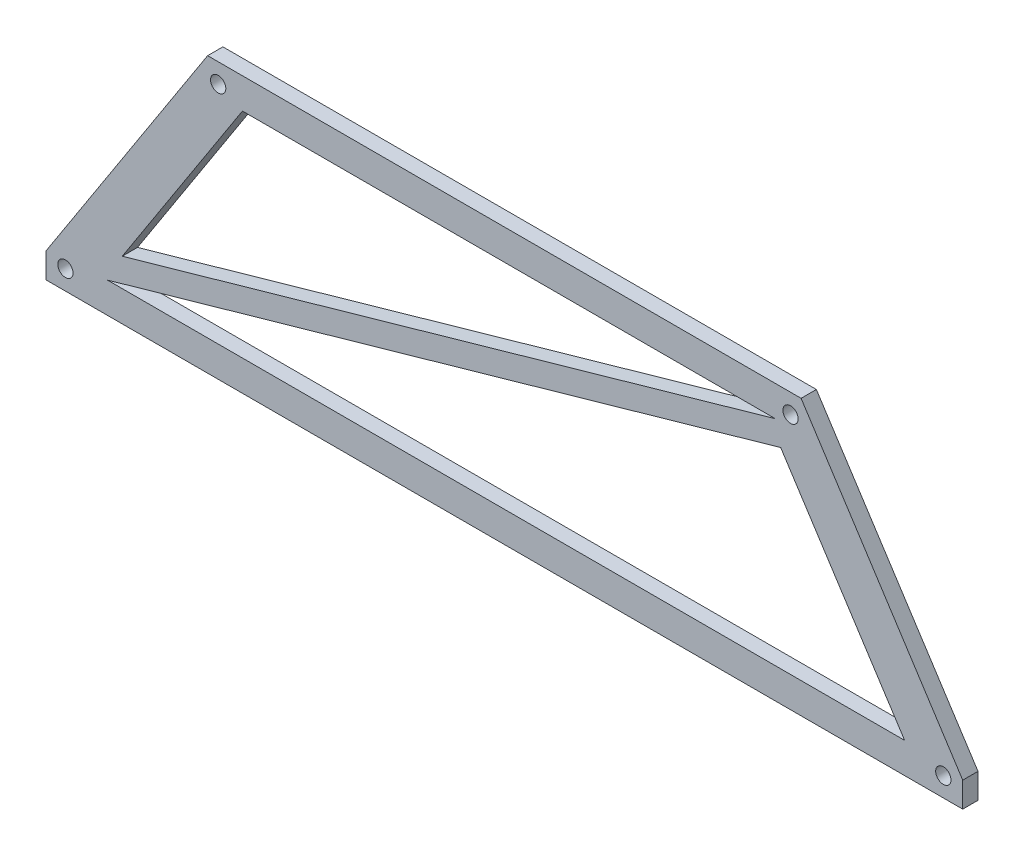
ISO-10303-21;
HEADER;
FILE_DESCRIPTION(('STEP AP214'),'2;1');
FILE_NAME('part.step','',(''),(''),'','','');
FILE_SCHEMA(('AUTOMOTIVE_DESIGN { 1 0 10303 214 1 1 1 1 }'));
ENDSEC;
DATA;
#1=APPLICATION_CONTEXT('core data for automotive mechanical design processes');
#2=APPLICATION_PROTOCOL_DEFINITION('international standard','automotive_design',2000,#1);
#3=PRODUCT_CONTEXT('',#1,'mechanical');
#4=PRODUCT('Part','Part','',(#3));
#5=PRODUCT_RELATED_PRODUCT_CATEGORY('part','',(#4));
#6=PRODUCT_DEFINITION_FORMATION('','',#4);
#7=PRODUCT_DEFINITION_CONTEXT('part definition',#1,'design');
#8=PRODUCT_DEFINITION('design','',#6,#7);
#9=PRODUCT_DEFINITION_SHAPE('','',#8);
#10=(LENGTH_UNIT() NAMED_UNIT(*) SI_UNIT(.MILLI.,.METRE.));
#11=(NAMED_UNIT(*) PLANE_ANGLE_UNIT() SI_UNIT($,.RADIAN.));
#12=(NAMED_UNIT(*) SI_UNIT($,.STERADIAN.) SOLID_ANGLE_UNIT());
#13=UNCERTAINTY_MEASURE_WITH_UNIT(LENGTH_MEASURE(1.E-05),#10,'distance_accuracy_value','');
#14=(GEOMETRIC_REPRESENTATION_CONTEXT(3) GLOBAL_UNCERTAINTY_ASSIGNED_CONTEXT((#13)) GLOBAL_UNIT_ASSIGNED_CONTEXT((#10,
#11,#12)) REPRESENTATION_CONTEXT('',''));
#15=CARTESIAN_POINT('',(0.,0.,0.));
#16=DIRECTION('',(0.,0.,1.));
#17=DIRECTION('',(1.,0.,0.));
#18=AXIS2_PLACEMENT_3D('',#15,#16,#17);
#19=CARTESIAN_POINT('',(0.,0.,10.));
#20=DIRECTION('',(0.,0.,-1.));
#21=DIRECTION('',(-1.,0.,0.));
#22=AXIS2_PLACEMENT_3D('',#19,#20,#21);
#23=PLANE('',#22);
#24=DIRECTION('',(0.961818470379362,0.273688198571118,0.));
#25=VECTOR('',#24,1.);
#26=CARTESIAN_POINT('',(-250.097346147262,-70.9031093060517,10.));
#27=LINE('',#26,#25);
#28=CARTESIAN_POINT('',(-250.097346147262,-70.9031093060517,10.));
#29=VERTEX_POINT('',#28);
#30=CARTESIAN_POINT('',(177.373034146836,50.734810871399,10.));
#31=VERTEX_POINT('',#30);
#32=EDGE_CURVE('E149',#29,#31,#27,.T.);
#33=ORIENTED_EDGE('',*,*,#32,.F.);
#34=DIRECTION('',(-0.543116154420269,-0.839657574733735,0.));
#35=VECTOR('',#34,1.);
#36=CARTESIAN_POINT('',(-171.418225722002,50.734810871399,10.));
#37=LINE('',#36,#35);
#38=CARTESIAN_POINT('',(-171.418225722002,50.734810871399,10.));
#39=VERTEX_POINT('',#38);
#40=EDGE_CURVE('E54',#39,#29,#37,.T.);
#41=ORIENTED_EDGE('',*,*,#40,.F.);
#42=DIRECTION('',(-1.,0.,0.));
#43=VECTOR('',#42,1.);
#44=CARTESIAN_POINT('',(177.373034146836,50.734810871399,10.));
#45=LINE('',#44,#43);
#46=EDGE_CURVE('E146',#31,#39,#45,.T.);
#47=ORIENTED_EDGE('',*,*,#46,.F.);
#48=EDGE_LOOP('',(#33,#41,#47));
#49=FACE_BOUND('',#48,.T.);
#50=DIRECTION('',(1.,0.,0.));
#51=VECTOR('',#50,1.);
#52=CARTESIAN_POINT('',(261.974499978147,-89.265189128601,10.));
#53=LINE('',#52,#51);
#54=CARTESIAN_POINT('',(-259.820043515291,-89.265189128601,10.));
#55=VERTEX_POINT('',#54);
#56=CARTESIAN_POINT('',(261.974499978147,-89.265189128601,10.));
#57=VERTEX_POINT('',#56);
#58=EDGE_CURVE('E170',#55,#57,#53,.T.);
#59=ORIENTED_EDGE('',*,*,#58,.F.);
#60=DIRECTION('',(-0.961818470379362,-0.273688198571119,0.));
#61=VECTOR('',#60,1.);
#62=CARTESIAN_POINT('',(-259.820043515291,-89.265189128601,10.));
#63=LINE('',#62,#61);
#64=CARTESIAN_POINT('',(180.863413893077,36.1325499589185,10.));
#65=VERTEX_POINT('',#64);
#66=EDGE_CURVE('E62',#65,#55,#63,.T.);
#67=ORIENTED_EDGE('',*,*,#66,.F.);
#68=DIRECTION('',(-0.543116154420269,0.839657574733735,0.));
#69=VECTOR('',#68,1.);
#70=CARTESIAN_POINT('',(180.863413893077,36.1325499589185,10.));
#71=LINE('',#70,#69);
#72=EDGE_CURVE('E162',#57,#65,#71,.T.);
#73=ORIENTED_EDGE('',*,*,#72,.F.);
#74=EDGE_LOOP('',(#59,#67,#73));
#75=FACE_BOUND('',#74,.T.);
#76=DIRECTION('',(-0.543116154420269,0.839657574733735,0.));
#77=VECTOR('',#76,1.);
#78=CARTESIAN_POINT('',(194.210465662985,70.734810871399,10.));
#79=LINE('',#78,#77);
#80=CARTESIAN_POINT('',(300.,-92.8158092136263,10.));
#81=VERTEX_POINT('',#80);
#82=CARTESIAN_POINT('',(194.210465662985,70.734810871399,10.));
#83=VERTEX_POINT('',#82);
#84=EDGE_CURVE('E205',#81,#83,#79,.T.);
#85=ORIENTED_EDGE('',*,*,#84,.T.);
#86=DIRECTION('',(-1.,0.,0.));
#87=VECTOR('',#86,1.);
#88=CARTESIAN_POINT('',(194.210465662985,70.734810871399,10.));
#89=LINE('',#88,#87);
#90=CARTESIAN_POINT('',(-194.210465662985,70.734810871399,10.));
#91=VERTEX_POINT('',#90);
#92=EDGE_CURVE('E208',#83,#91,#89,.T.);
#93=ORIENTED_EDGE('',*,*,#92,.T.);
#94=DIRECTION('',(-0.543116154420269,-0.839657574733735,0.));
#95=VECTOR('',#94,1.);
#96=CARTESIAN_POINT('',(-194.210465662985,70.734810871399,10.));
#97=LINE('',#96,#95);
#98=CARTESIAN_POINT('',(-300.,-92.8158092136263,10.));
#99=VERTEX_POINT('',#98);
#100=EDGE_CURVE('E211',#91,#99,#97,.T.);
#101=ORIENTED_EDGE('',*,*,#100,.T.);
#102=DIRECTION('',(0.,-1.,0.));
#103=VECTOR('',#102,1.);
#104=CARTESIAN_POINT('',(-300.,-109.265189128601,10.));
#105=LINE('',#104,#103);
#106=CARTESIAN_POINT('',(-300.,-109.265189128601,10.));
#107=VERTEX_POINT('',#106);
#108=EDGE_CURVE('E213',#99,#107,#105,.T.);
#109=ORIENTED_EDGE('',*,*,#108,.T.);
#110=DIRECTION('',(1.,0.,0.));
#111=VECTOR('',#110,1.);
#112=CARTESIAN_POINT('',(300.,-109.265189128601,10.));
#113=LINE('',#112,#111);
#114=CARTESIAN_POINT('',(300.,-109.265189128601,10.));
#115=VERTEX_POINT('',#114);
#116=EDGE_CURVE('E215',#107,#115,#113,.T.);
#117=ORIENTED_EDGE('',*,*,#116,.T.);
#118=DIRECTION('',(0.,1.,0.));
#119=VECTOR('',#118,1.);
#120=CARTESIAN_POINT('',(300.,-109.265189128601,10.));
#121=LINE('',#120,#119);
#122=EDGE_CURVE('E217',#115,#81,#121,.T.);
#123=ORIENTED_EDGE('',*,*,#122,.T.);
#124=EDGE_LOOP('',(#85,#93,#101,#109,#117,#123));
#125=FACE_BOUND('',#124,.T.);
#126=CARTESIAN_POINT('',(-187.3,58.034810871399,10.));
#127=DIRECTION('',(0.,0.,1.));
#128=DIRECTION('',(1.,0.,0.));
#129=AXIS2_PLACEMENT_3D('',#126,#127,#128);
#130=CIRCLE('',#129,4.99999999999999);
#131=CARTESIAN_POINT('',(-182.3,58.034810871399,10.));
#132=VERTEX_POINT('',#131);
#133=EDGE_CURVE('E199',#132,#132,#130,.T.);
#134=ORIENTED_EDGE('',*,*,#133,.F.);
#135=EDGE_LOOP('',(#134));
#136=FACE_BOUND('',#135,.T.);
#137=CARTESIAN_POINT('',(-287.3,-96.565189128601,10.));
#138=DIRECTION('',(0.,0.,1.));
#139=DIRECTION('',(1.,0.,0.));
#140=AXIS2_PLACEMENT_3D('',#137,#138,#139);
#141=CIRCLE('',#140,4.99999999999999);
#142=CARTESIAN_POINT('',(-282.3,-96.565189128601,10.));
#143=VERTEX_POINT('',#142);
#144=EDGE_CURVE('E193',#143,#143,#141,.T.);
#145=ORIENTED_EDGE('',*,*,#144,.F.);
#146=EDGE_LOOP('',(#145));
#147=FACE_BOUND('',#146,.T.);
#148=CARTESIAN_POINT('',(287.3,-96.565189128601,10.));
#149=DIRECTION('',(0.,0.,1.));
#150=DIRECTION('',(-1.,0.,0.));
#151=AXIS2_PLACEMENT_3D('',#148,#149,#150);
#152=CIRCLE('',#151,4.99999999999999);
#153=CARTESIAN_POINT('',(282.3,-96.565189128601,10.));
#154=VERTEX_POINT('',#153);
#155=EDGE_CURVE('E187',#154,#154,#152,.T.);
#156=ORIENTED_EDGE('',*,*,#155,.F.);
#157=EDGE_LOOP('',(#156));
#158=FACE_BOUND('',#157,.T.);
#159=CARTESIAN_POINT('',(187.3,58.034810871399,10.));
#160=DIRECTION('',(0.,0.,1.));
#161=DIRECTION('',(-1.,0.,0.));
#162=AXIS2_PLACEMENT_3D('',#159,#160,#161);
#163=CIRCLE('',#162,4.99999999999999);
#164=CARTESIAN_POINT('',(182.3,58.034810871399,10.));
#165=VERTEX_POINT('',#164);
#166=EDGE_CURVE('E181',#165,#165,#163,.T.);
#167=ORIENTED_EDGE('',*,*,#166,.F.);
#168=EDGE_LOOP('',(#167));
#169=FACE_BOUND('',#168,.T.);
#170=ADVANCED_FACE('F39',(#49,#75,#125,#136,#147,#158,#169),#23,.F.);
#171=CARTESIAN_POINT('',(0.,0.,0.));
#172=DIRECTION('',(0.,0.,-1.));
#173=DIRECTION('',(-1.,0.,0.));
#174=AXIS2_PLACEMENT_3D('',#171,#172,#173);
#175=PLANE('',#174);
#176=DIRECTION('',(-0.543116154420269,-0.839657574733735,0.));
#177=VECTOR('',#176,1.);
#178=CARTESIAN_POINT('',(-171.418225722002,50.734810871399,0.));
#179=LINE('',#178,#177);
#180=CARTESIAN_POINT('',(-171.418225722002,50.734810871399,0.));
#181=VERTEX_POINT('',#180);
#182=CARTESIAN_POINT('',(-250.097346147262,-70.9031093060517,0.));
#183=VERTEX_POINT('',#182);
#184=EDGE_CURVE('E130',#181,#183,#179,.T.);
#185=ORIENTED_EDGE('',*,*,#184,.T.);
#186=DIRECTION('',(0.961818470379362,0.273688198571118,0.));
#187=VECTOR('',#186,1.);
#188=CARTESIAN_POINT('',(-250.097346147262,-70.9031093060517,0.));
#189=LINE('',#188,#187);
#190=CARTESIAN_POINT('',(177.373034146836,50.734810871399,0.));
#191=VERTEX_POINT('',#190);
#192=EDGE_CURVE('E140',#183,#191,#189,.T.);
#193=ORIENTED_EDGE('',*,*,#192,.T.);
#194=DIRECTION('',(-1.,0.,0.));
#195=VECTOR('',#194,1.);
#196=CARTESIAN_POINT('',(177.373034146836,50.734810871399,0.));
#197=LINE('',#196,#195);
#198=EDGE_CURVE('E136',#191,#181,#197,.T.);
#199=ORIENTED_EDGE('',*,*,#198,.T.);
#200=EDGE_LOOP('',(#185,#193,#199));
#201=FACE_BOUND('',#200,.T.);
#202=DIRECTION('',(-0.961818470379362,-0.273688198571119,0.));
#203=VECTOR('',#202,1.);
#204=CARTESIAN_POINT('',(-259.820043515291,-89.265189128601,0.));
#205=LINE('',#204,#203);
#206=CARTESIAN_POINT('',(180.863413893077,36.1325499589185,0.));
#207=VERTEX_POINT('',#206);
#208=CARTESIAN_POINT('',(-259.820043515291,-89.265189128601,0.));
#209=VERTEX_POINT('',#208);
#210=EDGE_CURVE('E158',#207,#209,#205,.T.);
#211=ORIENTED_EDGE('',*,*,#210,.T.);
#212=DIRECTION('',(1.,0.,0.));
#213=VECTOR('',#212,1.);
#214=CARTESIAN_POINT('',(261.974499978147,-89.265189128601,0.));
#215=LINE('',#214,#213);
#216=CARTESIAN_POINT('',(261.974499978147,-89.265189128601,0.));
#217=VERTEX_POINT('',#216);
#218=EDGE_CURVE('E161',#209,#217,#215,.T.);
#219=ORIENTED_EDGE('',*,*,#218,.T.);
#220=DIRECTION('',(-0.543116154420269,0.839657574733735,0.));
#221=VECTOR('',#220,1.);
#222=CARTESIAN_POINT('',(180.863413893077,36.1325499589185,0.));
#223=LINE('',#222,#221);
#224=EDGE_CURVE('E165',#217,#207,#223,.T.);
#225=ORIENTED_EDGE('',*,*,#224,.T.);
#226=EDGE_LOOP('',(#211,#219,#225));
#227=FACE_BOUND('',#226,.T.);
#228=CARTESIAN_POINT('',(287.3,-96.565189128601,0.));
#229=DIRECTION('',(0.,0.,1.));
#230=DIRECTION('',(-1.,0.,0.));
#231=AXIS2_PLACEMENT_3D('',#228,#229,#230);
#232=CIRCLE('',#231,4.99999999999999);
#233=CARTESIAN_POINT('',(282.3,-96.565189128601,0.));
#234=VERTEX_POINT('',#233);
#235=EDGE_CURVE('E184',#234,#234,#232,.T.);
#236=ORIENTED_EDGE('',*,*,#235,.T.);
#237=EDGE_LOOP('',(#236));
#238=FACE_BOUND('',#237,.T.);
#239=CARTESIAN_POINT('',(-187.3,58.034810871399,0.));
#240=DIRECTION('',(0.,0.,1.));
#241=DIRECTION('',(1.,0.,0.));
#242=AXIS2_PLACEMENT_3D('',#239,#240,#241);
#243=CIRCLE('',#242,4.99999999999999);
#244=CARTESIAN_POINT('',(-182.3,58.034810871399,0.));
#245=VERTEX_POINT('',#244);
#246=EDGE_CURVE('E196',#245,#245,#243,.T.);
#247=ORIENTED_EDGE('',*,*,#246,.T.);
#248=EDGE_LOOP('',(#247));
#249=FACE_BOUND('',#248,.T.);
#250=DIRECTION('',(-0.543116154420269,0.839657574733735,0.));
#251=VECTOR('',#250,1.);
#252=CARTESIAN_POINT('',(194.210465662985,70.734810871399,0.));
#253=LINE('',#252,#251);
#254=CARTESIAN_POINT('',(300.,-92.8158092136263,0.));
#255=VERTEX_POINT('',#254);
#256=CARTESIAN_POINT('',(194.210465662985,70.734810871399,0.));
#257=VERTEX_POINT('',#256);
#258=EDGE_CURVE('E202',#255,#257,#253,.T.);
#259=ORIENTED_EDGE('',*,*,#258,.F.);
#260=DIRECTION('',(0.,1.,0.));
#261=VECTOR('',#260,1.);
#262=CARTESIAN_POINT('',(300.,-109.265189128601,0.));
#263=LINE('',#262,#261);
#264=CARTESIAN_POINT('',(300.,-109.265189128601,0.));
#265=VERTEX_POINT('',#264);
#266=EDGE_CURVE('E209',#265,#255,#263,.T.);
#267=ORIENTED_EDGE('',*,*,#266,.F.);
#268=DIRECTION('',(1.,0.,0.));
#269=VECTOR('',#268,1.);
#270=CARTESIAN_POINT('',(300.,-109.265189128601,0.));
#271=LINE('',#270,#269);
#272=CARTESIAN_POINT('',(-300.,-109.265189128601,0.));
#273=VERTEX_POINT('',#272);
#274=EDGE_CURVE('E228',#273,#265,#271,.T.);
#275=ORIENTED_EDGE('',*,*,#274,.F.);
#276=DIRECTION('',(0.,-1.,0.));
#277=VECTOR('',#276,1.);
#278=CARTESIAN_POINT('',(-300.,-109.265189128601,0.));
#279=LINE('',#278,#277);
#280=CARTESIAN_POINT('',(-300.,-92.8158092136263,0.));
#281=VERTEX_POINT('',#280);
#282=EDGE_CURVE('E226',#281,#273,#279,.T.);
#283=ORIENTED_EDGE('',*,*,#282,.F.);
#284=DIRECTION('',(-0.543116154420269,-0.839657574733735,0.));
#285=VECTOR('',#284,1.);
#286=CARTESIAN_POINT('',(-194.210465662985,70.734810871399,0.));
#287=LINE('',#286,#285);
#288=CARTESIAN_POINT('',(-194.210465662985,70.734810871399,0.));
#289=VERTEX_POINT('',#288);
#290=EDGE_CURVE('E224',#289,#281,#287,.T.);
#291=ORIENTED_EDGE('',*,*,#290,.F.);
#292=DIRECTION('',(-1.,0.,0.));
#293=VECTOR('',#292,1.);
#294=CARTESIAN_POINT('',(194.210465662985,70.734810871399,0.));
#295=LINE('',#294,#293);
#296=EDGE_CURVE('E222',#257,#289,#295,.T.);
#297=ORIENTED_EDGE('',*,*,#296,.F.);
#298=EDGE_LOOP('',(#259,#267,#275,#283,#291,#297));
#299=FACE_BOUND('',#298,.T.);
#300=CARTESIAN_POINT('',(-287.3,-96.565189128601,0.));
#301=DIRECTION('',(0.,0.,1.));
#302=DIRECTION('',(1.,0.,0.));
#303=AXIS2_PLACEMENT_3D('',#300,#301,#302);
#304=CIRCLE('',#303,4.99999999999999);
#305=CARTESIAN_POINT('',(-282.3,-96.565189128601,0.));
#306=VERTEX_POINT('',#305);
#307=EDGE_CURVE('E190',#306,#306,#304,.T.);
#308=ORIENTED_EDGE('',*,*,#307,.T.);
#309=EDGE_LOOP('',(#308));
#310=FACE_BOUND('',#309,.T.);
#311=CARTESIAN_POINT('',(187.3,58.034810871399,0.));
#312=DIRECTION('',(0.,0.,1.));
#313=DIRECTION('',(-1.,0.,0.));
#314=AXIS2_PLACEMENT_3D('',#311,#312,#313);
#315=CIRCLE('',#314,4.99999999999999);
#316=CARTESIAN_POINT('',(182.3,58.034810871399,0.));
#317=VERTEX_POINT('',#316);
#318=EDGE_CURVE('E177',#317,#317,#315,.T.);
#319=ORIENTED_EDGE('',*,*,#318,.T.);
#320=EDGE_LOOP('',(#319));
#321=FACE_BOUND('',#320,.T.);
#322=ADVANCED_FACE('F144',(#201,#227,#238,#249,#299,#310,#321),#175,.T.);
#323=CARTESIAN_POINT('',(194.210465662985,70.734810871399,10.));
#324=DIRECTION('',(-0.839657574733735,-0.543116154420269,0.));
#325=DIRECTION('',(0.543116154420269,-0.839657574733735,0.));
#326=AXIS2_PLACEMENT_3D('',#323,#324,#325);
#327=PLANE('',#326);
#328=ORIENTED_EDGE('',*,*,#258,.T.);
#329=DIRECTION('',(0.,0.,-1.));
#330=VECTOR('',#329,1.);
#331=CARTESIAN_POINT('',(194.210465662985,70.734810871399,10.));
#332=LINE('',#331,#330);
#333=EDGE_CURVE('E11',#83,#257,#332,.T.);
#334=ORIENTED_EDGE('',*,*,#333,.F.);
#335=ORIENTED_EDGE('',*,*,#84,.F.);
#336=DIRECTION('',(0.,0.,-1.));
#337=VECTOR('',#336,1.);
#338=CARTESIAN_POINT('',(300.,-92.8158092136263,10.));
#339=LINE('',#338,#337);
#340=EDGE_CURVE('E219',#81,#255,#339,.T.);
#341=ORIENTED_EDGE('',*,*,#340,.T.);
#342=EDGE_LOOP('',(#328,#334,#335,#341));
#343=FACE_BOUND('',#342,.T.);
#344=ADVANCED_FACE('F41',(#343),#327,.F.);
#345=CARTESIAN_POINT('',(194.210465662985,70.734810871399,10.));
#346=DIRECTION('',(0.,-1.,0.));
#347=DIRECTION('',(0.,0.,-1.));
#348=AXIS2_PLACEMENT_3D('',#345,#346,#347);
#349=PLANE('',#348);
#350=ORIENTED_EDGE('',*,*,#296,.T.);
#351=DIRECTION('',(0.,0.,-1.));
#352=VECTOR('',#351,1.);
#353=CARTESIAN_POINT('',(-194.210465662985,70.734810871399,10.));
#354=LINE('',#353,#352);
#355=EDGE_CURVE('E47',#91,#289,#354,.T.);
#356=ORIENTED_EDGE('',*,*,#355,.F.);
#357=ORIENTED_EDGE('',*,*,#92,.F.);
#358=ORIENTED_EDGE('',*,*,#333,.T.);
#359=EDGE_LOOP('',(#350,#356,#357,#358));
#360=FACE_BOUND('',#359,.T.);
#361=ADVANCED_FACE('F269',(#360),#349,.F.);
#362=CARTESIAN_POINT('',(-194.210465662985,70.734810871399,10.));
#363=DIRECTION('',(0.839657574733735,-0.543116154420269,0.));
#364=DIRECTION('',(0.543116154420269,0.839657574733735,0.));
#365=AXIS2_PLACEMENT_3D('',#362,#363,#364);
#366=PLANE('',#365);
#367=ORIENTED_EDGE('',*,*,#290,.T.);
#368=DIRECTION('',(0.,0.,-1.));
#369=VECTOR('',#368,1.);
#370=CARTESIAN_POINT('',(-300.,-92.8158092136263,10.));
#371=LINE('',#370,#369);
#372=EDGE_CURVE('E239',#99,#281,#371,.T.);
#373=ORIENTED_EDGE('',*,*,#372,.F.);
#374=ORIENTED_EDGE('',*,*,#100,.F.);
#375=ORIENTED_EDGE('',*,*,#355,.T.);
#376=EDGE_LOOP('',(#367,#373,#374,#375));
#377=FACE_BOUND('',#376,.T.);
#378=ADVANCED_FACE('F246',(#377),#366,.F.);
#379=CARTESIAN_POINT('',(-300.,-109.265189128601,10.));
#380=DIRECTION('',(1.,0.,0.));
#381=DIRECTION('',(0.,0.,-1.));
#382=AXIS2_PLACEMENT_3D('',#379,#380,#381);
#383=PLANE('',#382);
#384=ORIENTED_EDGE('',*,*,#282,.T.);
#385=DIRECTION('',(0.,0.,-1.));
#386=VECTOR('',#385,1.);
#387=CARTESIAN_POINT('',(-300.,-109.265189128601,10.));
#388=LINE('',#387,#386);
#389=EDGE_CURVE('E236',#107,#273,#388,.T.);
#390=ORIENTED_EDGE('',*,*,#389,.F.);
#391=ORIENTED_EDGE('',*,*,#108,.F.);
#392=ORIENTED_EDGE('',*,*,#372,.T.);
#393=EDGE_LOOP('',(#384,#390,#391,#392));
#394=FACE_BOUND('',#393,.T.);
#395=ADVANCED_FACE('F257',(#394),#383,.F.);
#396=CARTESIAN_POINT('',(300.,-109.265189128601,10.));
#397=DIRECTION('',(0.,1.,0.));
#398=DIRECTION('',(0.,0.,1.));
#399=AXIS2_PLACEMENT_3D('',#396,#397,#398);
#400=PLANE('',#399);
#401=ORIENTED_EDGE('',*,*,#274,.T.);
#402=DIRECTION('',(0.,0.,-1.));
#403=VECTOR('',#402,1.);
#404=CARTESIAN_POINT('',(300.,-109.265189128601,10.));
#405=LINE('',#404,#403);
#406=EDGE_CURVE('E233',#115,#265,#405,.T.);
#407=ORIENTED_EDGE('',*,*,#406,.F.);
#408=ORIENTED_EDGE('',*,*,#116,.F.);
#409=ORIENTED_EDGE('',*,*,#389,.T.);
#410=EDGE_LOOP('',(#401,#407,#408,#409));
#411=FACE_BOUND('',#410,.T.);
#412=ADVANCED_FACE('F261',(#411),#400,.F.);
#413=CARTESIAN_POINT('',(300.,-109.265189128601,10.));
#414=DIRECTION('',(-1.,0.,0.));
#415=DIRECTION('',(0.,0.,1.));
#416=AXIS2_PLACEMENT_3D('',#413,#414,#415);
#417=PLANE('',#416);
#418=ORIENTED_EDGE('',*,*,#266,.T.);
#419=ORIENTED_EDGE('',*,*,#340,.F.);
#420=ORIENTED_EDGE('',*,*,#122,.F.);
#421=ORIENTED_EDGE('',*,*,#406,.T.);
#422=EDGE_LOOP('',(#418,#419,#420,#421));
#423=FACE_BOUND('',#422,.T.);
#424=ADVANCED_FACE('F272',(#423),#417,.F.);
#425=CARTESIAN_POINT('',(-187.3,58.034810871399,10.));
#426=DIRECTION('',(0.,0.,-1.));
#427=DIRECTION('',(-1.,0.,0.));
#428=AXIS2_PLACEMENT_3D('',#425,#426,#427);
#429=CYLINDRICAL_SURFACE('',#428,4.99999999999999);
#430=ORIENTED_EDGE('',*,*,#133,.T.);
#431=EDGE_LOOP('',(#430));
#432=FACE_BOUND('',#431,.T.);
#433=ORIENTED_EDGE('',*,*,#246,.F.);
#434=EDGE_LOOP('',(#433));
#435=FACE_BOUND('',#434,.T.);
#436=ADVANCED_FACE('F274',(#432,#435),#429,.F.);
#437=CARTESIAN_POINT('',(-287.3,-96.565189128601,10.));
#438=DIRECTION('',(0.,0.,-1.));
#439=DIRECTION('',(-1.,0.,0.));
#440=AXIS2_PLACEMENT_3D('',#437,#438,#439);
#441=CYLINDRICAL_SURFACE('',#440,4.99999999999999);
#442=ORIENTED_EDGE('',*,*,#144,.T.);
#443=EDGE_LOOP('',(#442));
#444=FACE_BOUND('',#443,.T.);
#445=ORIENTED_EDGE('',*,*,#307,.F.);
#446=EDGE_LOOP('',(#445));
#447=FACE_BOUND('',#446,.T.);
#448=ADVANCED_FACE('F280',(#444,#447),#441,.F.);
#449=CARTESIAN_POINT('',(287.3,-96.565189128601,10.));
#450=DIRECTION('',(0.,0.,-1.));
#451=DIRECTION('',(-1.,0.,0.));
#452=AXIS2_PLACEMENT_3D('',#449,#450,#451);
#453=CYLINDRICAL_SURFACE('',#452,4.99999999999999);
#454=ORIENTED_EDGE('',*,*,#155,.T.);
#455=EDGE_LOOP('',(#454));
#456=FACE_BOUND('',#455,.T.);
#457=ORIENTED_EDGE('',*,*,#235,.F.);
#458=EDGE_LOOP('',(#457));
#459=FACE_BOUND('',#458,.T.);
#460=ADVANCED_FACE('F296',(#456,#459),#453,.F.);
#461=CARTESIAN_POINT('',(187.3,58.034810871399,10.));
#462=DIRECTION('',(0.,0.,-1.));
#463=DIRECTION('',(-1.,0.,0.));
#464=AXIS2_PLACEMENT_3D('',#461,#462,#463);
#465=CYLINDRICAL_SURFACE('',#464,4.99999999999999);
#466=ORIENTED_EDGE('',*,*,#166,.T.);
#467=EDGE_LOOP('',(#466));
#468=FACE_BOUND('',#467,.T.);
#469=ORIENTED_EDGE('',*,*,#318,.F.);
#470=EDGE_LOOP('',(#469));
#471=FACE_BOUND('',#470,.T.);
#472=ADVANCED_FACE('F300',(#468,#471),#465,.F.);
#473=CARTESIAN_POINT('',(-259.820043515291,-89.265189128601,0.));
#474=DIRECTION('',(-0.273688198571119,0.961818470379362,0.));
#475=DIRECTION('',(-0.961818470379362,-0.273688198571119,0.));
#476=AXIS2_PLACEMENT_3D('',#473,#474,#475);
#477=PLANE('',#476);
#478=ORIENTED_EDGE('',*,*,#66,.T.);
#479=DIRECTION('',(0.,0.,1.));
#480=VECTOR('',#479,1.);
#481=CARTESIAN_POINT('',(-259.820043515291,-89.265189128601,0.));
#482=LINE('',#481,#480);
#483=EDGE_CURVE('E168',#209,#55,#482,.T.);
#484=ORIENTED_EDGE('',*,*,#483,.F.);
#485=ORIENTED_EDGE('',*,*,#210,.F.);
#486=DIRECTION('',(0.,0.,1.));
#487=VECTOR('',#486,1.);
#488=CARTESIAN_POINT('',(180.863413893077,36.1325499589185,0.));
#489=LINE('',#488,#487);
#490=EDGE_CURVE('E175',#207,#65,#489,.T.);
#491=ORIENTED_EDGE('',*,*,#490,.T.);
#492=EDGE_LOOP('',(#478,#484,#485,#491));
#493=FACE_BOUND('',#492,.T.);
#494=ADVANCED_FACE('F304',(#493),#477,.F.);
#495=CARTESIAN_POINT('',(180.863413893077,36.1325499589185,0.));
#496=DIRECTION('',(0.839657574733735,0.543116154420269,0.));
#497=DIRECTION('',(-0.543116154420269,0.839657574733735,0.));
#498=AXIS2_PLACEMENT_3D('',#495,#496,#497);
#499=PLANE('',#498);
#500=ORIENTED_EDGE('',*,*,#72,.T.);
#501=ORIENTED_EDGE('',*,*,#490,.F.);
#502=ORIENTED_EDGE('',*,*,#224,.F.);
#503=DIRECTION('',(0.,0.,1.));
#504=VECTOR('',#503,1.);
#505=CARTESIAN_POINT('',(261.974499978147,-89.265189128601,0.));
#506=LINE('',#505,#504);
#507=EDGE_CURVE('E178',#217,#57,#506,.T.);
#508=ORIENTED_EDGE('',*,*,#507,.T.);
#509=EDGE_LOOP('',(#500,#501,#502,#508));
#510=FACE_BOUND('',#509,.T.);
#511=ADVANCED_FACE('F308',(#510),#499,.F.);
#512=CARTESIAN_POINT('',(261.974499978147,-89.265189128601,0.));
#513=DIRECTION('',(0.,-1.,0.));
#514=DIRECTION('',(1.,0.,0.));
#515=AXIS2_PLACEMENT_3D('',#512,#513,#514);
#516=PLANE('',#515);
#517=ORIENTED_EDGE('',*,*,#58,.T.);
#518=ORIENTED_EDGE('',*,*,#507,.F.);
#519=ORIENTED_EDGE('',*,*,#218,.F.);
#520=ORIENTED_EDGE('',*,*,#483,.T.);
#521=EDGE_LOOP('',(#517,#518,#519,#520));
#522=FACE_BOUND('',#521,.T.);
#523=ADVANCED_FACE('F309',(#522),#516,.F.);
#524=CARTESIAN_POINT('',(-171.418225722002,50.734810871399,0.));
#525=DIRECTION('',(-0.839657574733735,0.543116154420269,0.));
#526=DIRECTION('',(-0.543116154420269,-0.839657574733736,0.));
#527=AXIS2_PLACEMENT_3D('',#524,#525,#526);
#528=PLANE('',#527);
#529=ORIENTED_EDGE('',*,*,#40,.T.);
#530=DIRECTION('',(0.,0.,1.));
#531=VECTOR('',#530,1.);
#532=CARTESIAN_POINT('',(-250.097346147262,-70.9031093060517,0.));
#533=LINE('',#532,#531);
#534=EDGE_CURVE('E126',#183,#29,#533,.T.);
#535=ORIENTED_EDGE('',*,*,#534,.F.);
#536=ORIENTED_EDGE('',*,*,#184,.F.);
#537=DIRECTION('',(0.,0.,1.));
#538=VECTOR('',#537,1.);
#539=CARTESIAN_POINT('',(-171.418225722002,50.734810871399,0.));
#540=LINE('',#539,#538);
#541=EDGE_CURVE('E155',#181,#39,#540,.T.);
#542=ORIENTED_EDGE('',*,*,#541,.T.);
#543=EDGE_LOOP('',(#529,#535,#536,#542));
#544=FACE_BOUND('',#543,.T.);
#545=ADVANCED_FACE('F128',(#544),#528,.F.);
#546=CARTESIAN_POINT('',(177.373034146836,50.734810871399,0.));
#547=DIRECTION('',(0.,1.,0.));
#548=DIRECTION('',(0.,0.,1.));
#549=AXIS2_PLACEMENT_3D('',#546,#547,#548);
#550=PLANE('',#549);
#551=ORIENTED_EDGE('',*,*,#46,.T.);
#552=ORIENTED_EDGE('',*,*,#541,.F.);
#553=ORIENTED_EDGE('',*,*,#198,.F.);
#554=DIRECTION('',(0.,0.,1.));
#555=VECTOR('',#554,1.);
#556=CARTESIAN_POINT('',(177.373034146836,50.734810871399,0.));
#557=LINE('',#556,#555);
#558=EDGE_CURVE('E135',#191,#31,#557,.T.);
#559=ORIENTED_EDGE('',*,*,#558,.T.);
#560=EDGE_LOOP('',(#551,#552,#553,#559));
#561=FACE_BOUND('',#560,.T.);
#562=ADVANCED_FACE('F318',(#561),#550,.F.);
#563=CARTESIAN_POINT('',(-250.097346147262,-70.9031093060517,0.));
#564=DIRECTION('',(0.273688198571118,-0.961818470379362,0.));
#565=DIRECTION('',(0.961818470379362,0.273688198571118,0.));
#566=AXIS2_PLACEMENT_3D('',#563,#564,#565);
#567=PLANE('',#566);
#568=ORIENTED_EDGE('',*,*,#32,.T.);
#569=ORIENTED_EDGE('',*,*,#558,.F.);
#570=ORIENTED_EDGE('',*,*,#192,.F.);
#571=ORIENTED_EDGE('',*,*,#534,.T.);
#572=EDGE_LOOP('',(#568,#569,#570,#571));
#573=FACE_BOUND('',#572,.T.);
#574=ADVANCED_FACE('F141',(#573),#567,.F.);
#575=CLOSED_SHELL('',(#170,#322,#344,#361,#378,#395,#412,#424,#436,#448,#460,#472,#494,#511,
#523,#545,#562,#574));
#576=MANIFOLD_SOLID_BREP('B2',#575);
#577=ADVANCED_BREP_SHAPE_REPRESENTATION('',(#18,#576),#14);
#578=SHAPE_DEFINITION_REPRESENTATION(#9,#577);
ENDSEC;
END-ISO-10303-21;
